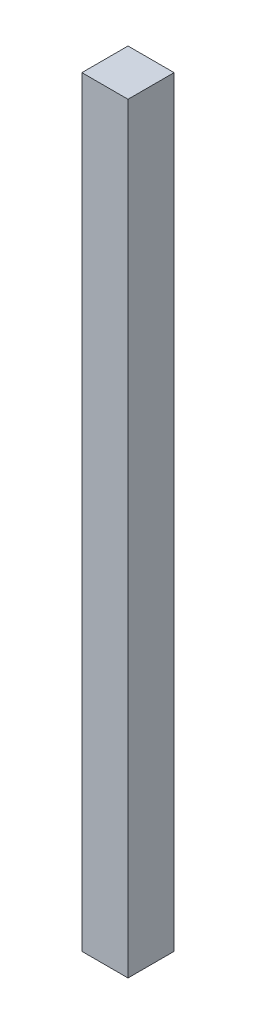
ISO-10303-21;
HEADER;
FILE_DESCRIPTION(('STEP AP214'),'2;1');
FILE_NAME('part.step','',(''),(''),'','','');
FILE_SCHEMA(('AUTOMOTIVE_DESIGN { 1 0 10303 214 1 1 1 1 }'));
ENDSEC;
DATA;
#1=APPLICATION_CONTEXT('core data for automotive mechanical design processes');
#2=APPLICATION_PROTOCOL_DEFINITION('international standard','automotive_design',2000,#1);
#3=PRODUCT_CONTEXT('',#1,'mechanical');
#4=PRODUCT('Part','Part','',(#3));
#5=PRODUCT_RELATED_PRODUCT_CATEGORY('part','',(#4));
#6=PRODUCT_DEFINITION_FORMATION('','',#4);
#7=PRODUCT_DEFINITION_CONTEXT('part definition',#1,'design');
#8=PRODUCT_DEFINITION('design','',#6,#7);
#9=PRODUCT_DEFINITION_SHAPE('','',#8);
#10=(LENGTH_UNIT() NAMED_UNIT(*) SI_UNIT(.MILLI.,.METRE.));
#11=(NAMED_UNIT(*) PLANE_ANGLE_UNIT() SI_UNIT($,.RADIAN.));
#12=(NAMED_UNIT(*) SI_UNIT($,.STERADIAN.) SOLID_ANGLE_UNIT());
#13=UNCERTAINTY_MEASURE_WITH_UNIT(LENGTH_MEASURE(1.E-05),#10,'distance_accuracy_value','');
#14=(GEOMETRIC_REPRESENTATION_CONTEXT(3) GLOBAL_UNCERTAINTY_ASSIGNED_CONTEXT((#13)) GLOBAL_UNIT_ASSIGNED_CONTEXT((#10,
#11,#12)) REPRESENTATION_CONTEXT('',''));
#15=CARTESIAN_POINT('',(0.,0.,0.));
#16=DIRECTION('',(0.,0.,1.));
#17=DIRECTION('',(1.,0.,0.));
#18=AXIS2_PLACEMENT_3D('',#15,#16,#17);
#19=CARTESIAN_POINT('',(0.,358.330629102884,0.));
#20=DIRECTION('',(1.,0.,0.));
#21=DIRECTION('',(0.,0.,-1.));
#22=AXIS2_PLACEMENT_3D('',#19,#20,#21);
#23=PLANE('',#22);
#24=DIRECTION('',(0.,0.,1.));
#25=VECTOR('',#24,1.);
#26=CARTESIAN_POINT('',(0.,330.046357855422,0.));
#27=LINE('',#26,#25);
#28=CARTESIAN_POINT('',(0.,330.046357855422,2.44304576568766E-12));
#29=VERTEX_POINT('',#28);
#30=CARTESIAN_POINT('',(0.,330.046357855422,20.));
#31=VERTEX_POINT('',#30);
#32=EDGE_CURVE('E101',#29,#31,#27,.T.);
#33=ORIENTED_EDGE('',*,*,#32,.F.);
#34=DIRECTION('',(0.,-1.,0.));
#35=VECTOR('',#34,1.);
#36=CARTESIAN_POINT('',(0.,358.330629102884,0.));
#37=LINE('',#36,#35);
#38=CARTESIAN_POINT('',(0.,0.,0.));
#39=VERTEX_POINT('',#38);
#40=EDGE_CURVE('E92',#29,#39,#37,.T.);
#41=ORIENTED_EDGE('',*,*,#40,.T.);
#42=DIRECTION('',(0.,0.,1.));
#43=VECTOR('',#42,1.);
#44=CARTESIAN_POINT('',(0.,0.,0.));
#45=LINE('',#44,#43);
#46=CARTESIAN_POINT('',(0.,0.,20.));
#47=VERTEX_POINT('',#46);
#48=EDGE_CURVE('E83',#39,#47,#45,.T.);
#49=ORIENTED_EDGE('',*,*,#48,.T.);
#50=DIRECTION('',(0.,-1.,0.));
#51=VECTOR('',#50,1.);
#52=CARTESIAN_POINT('',(0.,358.330629102884,20.));
#53=LINE('',#52,#51);
#54=EDGE_CURVE('E75',#31,#47,#53,.T.);
#55=ORIENTED_EDGE('',*,*,#54,.F.);
#56=EDGE_LOOP('',(#33,#41,#49,#55));
#57=FACE_BOUND('',#56,.T.);
#58=ADVANCED_FACE('F33',(#57),#23,.F.);
#59=CARTESIAN_POINT('',(0.,358.330629102884,20.));
#60=DIRECTION('',(0.,0.,-1.));
#61=DIRECTION('',(-1.,0.,0.));
#62=AXIS2_PLACEMENT_3D('',#59,#60,#61);
#63=PLANE('',#62);
#64=DIRECTION('',(1.,0.,0.));
#65=VECTOR('',#64,1.);
#66=CARTESIAN_POINT('',(0.,330.046357855422,20.));
#67=LINE('',#66,#65);
#68=CARTESIAN_POINT('',(20.,330.046357855422,20.));
#69=VERTEX_POINT('',#68);
#70=EDGE_CURVE('E37',#31,#69,#67,.T.);
#71=ORIENTED_EDGE('',*,*,#70,.F.);
#72=ORIENTED_EDGE('',*,*,#54,.T.);
#73=DIRECTION('',(1.,0.,0.));
#74=VECTOR('',#73,1.);
#75=CARTESIAN_POINT('',(0.,0.,20.));
#76=LINE('',#75,#74);
#77=CARTESIAN_POINT('',(20.,0.,20.));
#78=VERTEX_POINT('',#77);
#79=EDGE_CURVE('E78',#47,#78,#76,.T.);
#80=ORIENTED_EDGE('',*,*,#79,.T.);
#81=DIRECTION('',(0.,-1.,0.));
#82=VECTOR('',#81,1.);
#83=CARTESIAN_POINT('',(20.,358.330629102884,20.));
#84=LINE('',#83,#82);
#85=EDGE_CURVE('E69',#69,#78,#84,.T.);
#86=ORIENTED_EDGE('',*,*,#85,.F.);
#87=EDGE_LOOP('',(#71,#72,#80,#86));
#88=FACE_BOUND('',#87,.T.);
#89=ADVANCED_FACE('F77',(#88),#63,.F.);
#90=CARTESIAN_POINT('',(20.,358.330629102884,0.));
#91=DIRECTION('',(-1.,0.,0.));
#92=DIRECTION('',(0.,0.,1.));
#93=AXIS2_PLACEMENT_3D('',#90,#91,#92);
#94=PLANE('',#93);
#95=DIRECTION('',(0.,0.,-1.));
#96=VECTOR('',#95,1.);
#97=CARTESIAN_POINT('',(20.,330.046357855422,0.));
#98=LINE('',#97,#96);
#99=CARTESIAN_POINT('',(20.,330.046357855422,0.));
#100=VERTEX_POINT('',#99);
#101=EDGE_CURVE('E43',#69,#100,#98,.T.);
#102=ORIENTED_EDGE('',*,*,#101,.F.);
#103=ORIENTED_EDGE('',*,*,#85,.T.);
#104=DIRECTION('',(0.,0.,-1.));
#105=VECTOR('',#104,1.);
#106=CARTESIAN_POINT('',(20.,0.,0.));
#107=LINE('',#106,#105);
#108=CARTESIAN_POINT('',(20.,0.,0.));
#109=VERTEX_POINT('',#108);
#110=EDGE_CURVE('E89',#78,#109,#107,.T.);
#111=ORIENTED_EDGE('',*,*,#110,.T.);
#112=DIRECTION('',(0.,-1.,0.));
#113=VECTOR('',#112,1.);
#114=CARTESIAN_POINT('',(20.,358.330629102884,0.));
#115=LINE('',#114,#113);
#116=EDGE_CURVE('E99',#100,#109,#115,.T.);
#117=ORIENTED_EDGE('',*,*,#116,.F.);
#118=EDGE_LOOP('',(#102,#103,#111,#117));
#119=FACE_BOUND('',#118,.T.);
#120=ADVANCED_FACE('F106',(#119),#94,.F.);
#121=CARTESIAN_POINT('',(0.,358.330629102884,0.));
#122=DIRECTION('',(0.,0.,1.));
#123=DIRECTION('',(1.,0.,0.));
#124=AXIS2_PLACEMENT_3D('',#121,#122,#123);
#125=PLANE('',#124);
#126=DIRECTION('',(-1.,0.,0.));
#127=VECTOR('',#126,1.);
#128=CARTESIAN_POINT('',(0.,330.046357855422,0.));
#129=LINE('',#128,#127);
#130=EDGE_CURVE('E11',#100,#29,#129,.T.);
#131=ORIENTED_EDGE('',*,*,#130,.F.);
#132=ORIENTED_EDGE('',*,*,#116,.T.);
#133=DIRECTION('',(-1.,0.,0.));
#134=VECTOR('',#133,1.);
#135=CARTESIAN_POINT('',(0.,0.,0.));
#136=LINE('',#135,#134);
#137=EDGE_CURVE('E100',#109,#39,#136,.T.);
#138=ORIENTED_EDGE('',*,*,#137,.T.);
#139=ORIENTED_EDGE('',*,*,#40,.F.);
#140=EDGE_LOOP('',(#131,#132,#138,#139));
#141=FACE_BOUND('',#140,.T.);
#142=ADVANCED_FACE('F107',(#141),#125,.F.);
#143=CARTESIAN_POINT('',(0.,0.,0.));
#144=DIRECTION('',(0.,1.,0.));
#145=DIRECTION('',(0.,0.,1.));
#146=AXIS2_PLACEMENT_3D('',#143,#144,#145);
#147=PLANE('',#146);
#148=ORIENTED_EDGE('',*,*,#48,.F.);
#149=ORIENTED_EDGE('',*,*,#137,.F.);
#150=ORIENTED_EDGE('',*,*,#110,.F.);
#151=ORIENTED_EDGE('',*,*,#79,.F.);
#152=EDGE_LOOP('',(#148,#149,#150,#151));
#153=FACE_BOUND('',#152,.T.);
#154=ADVANCED_FACE('F87',(#153),#147,.F.);
#155=CARTESIAN_POINT('',(20.,330.046357855422,-20.5695490700701));
#156=DIRECTION('',(0.,1.,0.));
#157=DIRECTION('',(0.,0.,-1.));
#158=AXIS2_PLACEMENT_3D('',#155,#156,#157);
#159=PLANE('',#158);
#160=ORIENTED_EDGE('',*,*,#32,.T.);
#161=ORIENTED_EDGE('',*,*,#70,.T.);
#162=ORIENTED_EDGE('',*,*,#101,.T.);
#163=ORIENTED_EDGE('',*,*,#130,.T.);
#164=EDGE_LOOP('',(#160,#161,#162,#163));
#165=FACE_BOUND('',#164,.T.);
#166=ADVANCED_FACE('F35',(#165),#159,.T.);
#167=CLOSED_SHELL('',(#58,#89,#120,#142,#154,#166));
#168=MANIFOLD_SOLID_BREP('B2',#167);
#169=ADVANCED_BREP_SHAPE_REPRESENTATION('',(#18,#168),#14);
#170=SHAPE_DEFINITION_REPRESENTATION(#9,#169);
ENDSEC;
END-ISO-10303-21;
